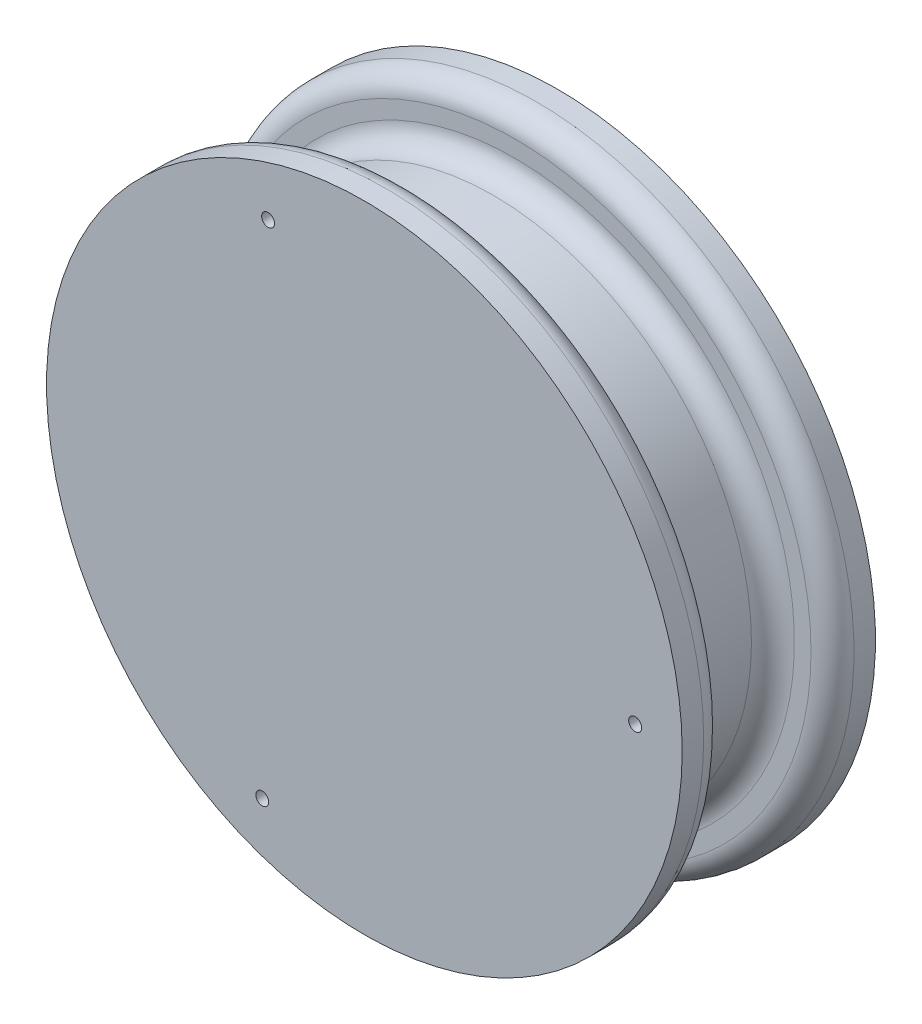
ISO-10303-21;
HEADER;
FILE_DESCRIPTION(('STEP AP214'),'2;1');
FILE_NAME('part.step','',(''),(''),'','','');
FILE_SCHEMA(('AUTOMOTIVE_DESIGN { 1 0 10303 214 1 1 1 1 }'));
ENDSEC;
DATA;
#1=APPLICATION_CONTEXT('core data for automotive mechanical design processes');
#2=APPLICATION_PROTOCOL_DEFINITION('international standard','automotive_design',2000,#1);
#3=PRODUCT_CONTEXT('',#1,'mechanical');
#4=PRODUCT('Part','Part','',(#3));
#5=PRODUCT_RELATED_PRODUCT_CATEGORY('part','',(#4));
#6=PRODUCT_DEFINITION_FORMATION('','',#4);
#7=PRODUCT_DEFINITION_CONTEXT('part definition',#1,'design');
#8=PRODUCT_DEFINITION('design','',#6,#7);
#9=PRODUCT_DEFINITION_SHAPE('','',#8);
#10=(LENGTH_UNIT() NAMED_UNIT(*) SI_UNIT(.MILLI.,.METRE.));
#11=(NAMED_UNIT(*) PLANE_ANGLE_UNIT() SI_UNIT($,.RADIAN.));
#12=(NAMED_UNIT(*) SI_UNIT($,.STERADIAN.) SOLID_ANGLE_UNIT());
#13=UNCERTAINTY_MEASURE_WITH_UNIT(LENGTH_MEASURE(1.E-05),#10,'distance_accuracy_value','');
#14=(GEOMETRIC_REPRESENTATION_CONTEXT(3) GLOBAL_UNCERTAINTY_ASSIGNED_CONTEXT((#13)) GLOBAL_UNIT_ASSIGNED_CONTEXT((#10,
#11,#12)) REPRESENTATION_CONTEXT('',''));
#15=CARTESIAN_POINT('',(0.,0.,0.));
#16=DIRECTION('',(0.,0.,1.));
#17=DIRECTION('',(1.,0.,0.));
#18=AXIS2_PLACEMENT_3D('',#15,#16,#17);
#19=CARTESIAN_POINT('',(0.,0.,-10.8));
#20=DIRECTION('',(0.,0.,-1.));
#21=DIRECTION('',(-1.,0.,0.));
#22=AXIS2_PLACEMENT_3D('',#19,#20,#21);
#23=PLANE('',#22);
#24=CARTESIAN_POINT('',(0.,0.,-10.8));
#25=DIRECTION('',(0.,0.,-1.));
#26=DIRECTION('',(-1.,0.,0.));
#27=AXIS2_PLACEMENT_3D('',#24,#25,#26);
#28=CIRCLE('',#27,6.08553702502468);
#29=CARTESIAN_POINT('',(6.08553702502468,0.,-10.8));
#30=VERTEX_POINT('',#29);
#31=EDGE_CURVE('E229',#30,#30,#28,.T.);
#32=ORIENTED_EDGE('',*,*,#31,.T.);
#33=EDGE_LOOP('',(#32));
#34=FACE_BOUND('',#33,.T.);
#35=CARTESIAN_POINT('',(0.,0.,-10.8));
#36=DIRECTION('',(0.,0.,-1.));
#37=DIRECTION('',(-1.,0.,0.));
#38=AXIS2_PLACEMENT_3D('',#35,#36,#37);
#39=CIRCLE('',#38,3.4);
#40=CARTESIAN_POINT('',(-2.50399680510978,-2.3,-10.8));
#41=VERTEX_POINT('',#40);
#42=CARTESIAN_POINT('',(-2.50399680510978,2.3,-10.8));
#43=VERTEX_POINT('',#42);
#44=EDGE_CURVE('E252',#41,#43,#39,.T.);
#45=ORIENTED_EDGE('',*,*,#44,.F.);
#46=DIRECTION('',(1.,0.,0.));
#47=VECTOR('',#46,1.);
#48=CARTESIAN_POINT('',(0.,-2.3,-10.8));
#49=LINE('',#48,#47);
#50=CARTESIAN_POINT('',(2.50399680510978,-2.3,-10.8));
#51=VERTEX_POINT('',#50);
#52=EDGE_CURVE('E242',#41,#51,#49,.T.);
#53=ORIENTED_EDGE('',*,*,#52,.T.);
#54=CARTESIAN_POINT('',(0.,0.,-10.8));
#55=DIRECTION('',(0.,0.,1.));
#56=DIRECTION('',(1.,0.,0.));
#57=AXIS2_PLACEMENT_3D('',#54,#55,#56);
#58=CIRCLE('',#57,3.4);
#59=CARTESIAN_POINT('',(2.50399680510978,2.3,-10.8));
#60=VERTEX_POINT('',#59);
#61=EDGE_CURVE('E246',#51,#60,#58,.T.);
#62=ORIENTED_EDGE('',*,*,#61,.T.);
#63=DIRECTION('',(1.,0.,0.));
#64=VECTOR('',#63,1.);
#65=CARTESIAN_POINT('',(0.,2.3,-10.8));
#66=LINE('',#65,#64);
#67=EDGE_CURVE('E249',#43,#60,#66,.T.);
#68=ORIENTED_EDGE('',*,*,#67,.F.);
#69=EDGE_LOOP('',(#45,#53,#62,#68));
#70=FACE_BOUND('',#69,.T.);
#71=ADVANCED_FACE('F37',(#34,#70),#23,.T.);
#72=CARTESIAN_POINT('',(0.,0.,2.));
#73=DIRECTION('',(0.,0.,-1.));
#74=DIRECTION('',(-1.,0.,0.));
#75=AXIS2_PLACEMENT_3D('',#72,#73,#74);
#76=CYLINDRICAL_SURFACE('',#75,14.7992420917299);
#77=CARTESIAN_POINT('',(0.,0.,1.));
#78=DIRECTION('',(0.,0.,1.));
#79=DIRECTION('',(1.,0.,0.));
#80=AXIS2_PLACEMENT_3D('',#77,#78,#79);
#81=CIRCLE('',#80,14.7992420917299);
#82=CARTESIAN_POINT('',(14.7992420917299,0.,1.));
#83=VERTEX_POINT('',#82);
#84=EDGE_CURVE('E217',#83,#83,#81,.T.);
#85=ORIENTED_EDGE('',*,*,#84,.T.);
#86=EDGE_LOOP('',(#85));
#87=FACE_BOUND('',#86,.T.);
#88=CARTESIAN_POINT('',(0.,0.,2.));
#89=DIRECTION('',(0.,0.,1.));
#90=DIRECTION('',(1.,0.,0.));
#91=AXIS2_PLACEMENT_3D('',#88,#89,#90);
#92=CIRCLE('',#91,14.7992420917299);
#93=CARTESIAN_POINT('',(14.7992420917299,0.,2.));
#94=VERTEX_POINT('',#93);
#95=EDGE_CURVE('E222',#94,#94,#92,.T.);
#96=ORIENTED_EDGE('',*,*,#95,.F.);
#97=EDGE_LOOP('',(#96));
#98=FACE_BOUND('',#97,.T.);
#99=ADVANCED_FACE('F176',(#87,#98),#76,.T.);
#100=CARTESIAN_POINT('',(0.,0.,2.));
#101=DIRECTION('',(0.,0.,1.));
#102=DIRECTION('',(1.,0.,0.));
#103=AXIS2_PLACEMENT_3D('',#100,#101,#102);
#104=PLANE('',#103);
#105=CARTESIAN_POINT('',(12.6107717154399,0.,2.));
#106=DIRECTION('',(0.,0.,1.));
#107=DIRECTION('',(1.,0.,0.));
#108=AXIS2_PLACEMENT_3D('',#105,#106,#107);
#109=CIRCLE('',#108,0.302475122375686);
#110=CARTESIAN_POINT('',(12.9132468378156,0.,2.));
#111=VERTEX_POINT('',#110);
#112=EDGE_CURVE('E110',#111,#111,#109,.T.);
#113=ORIENTED_EDGE('',*,*,#112,.F.);
#114=EDGE_LOOP('',(#113));
#115=FACE_BOUND('',#114,.T.);
#116=CARTESIAN_POINT('',(-4.48430239626418,11.7865429739936,2.));
#117=DIRECTION('',(0.,0.,1.));
#118=DIRECTION('',(1.,0.,0.));
#119=AXIS2_PLACEMENT_3D('',#116,#117,#118);
#120=CIRCLE('',#119,0.3);
#121=CARTESIAN_POINT('',(-4.18430239626418,11.7865429739936,2.));
#122=VERTEX_POINT('',#121);
#123=EDGE_CURVE('E269',#122,#122,#120,.T.);
#124=ORIENTED_EDGE('',*,*,#123,.F.);
#125=EDGE_LOOP('',(#124));
#126=FACE_BOUND('',#125,.T.);
#127=CARTESIAN_POINT('',(-4.75570442853812,-11.679676307472,2.));
#128=DIRECTION('',(0.,0.,1.));
#129=DIRECTION('',(1.,0.,0.));
#130=AXIS2_PLACEMENT_3D('',#127,#128,#129);
#131=CIRCLE('',#130,0.3);
#132=CARTESIAN_POINT('',(-4.45570442853812,-11.679676307472,2.));
#133=VERTEX_POINT('',#132);
#134=EDGE_CURVE('E266',#133,#133,#131,.T.);
#135=ORIENTED_EDGE('',*,*,#134,.F.);
#136=EDGE_LOOP('',(#135));
#137=FACE_BOUND('',#136,.T.);
#138=ORIENTED_EDGE('',*,*,#95,.T.);
#139=EDGE_LOOP('',(#138));
#140=FACE_BOUND('',#139,.T.);
#141=ADVANCED_FACE('F199',(#115,#126,#137,#140),#104,.T.);
#142=CARTESIAN_POINT('',(0.,0.,0.));
#143=DIRECTION('',(0.,0.,1.));
#144=DIRECTION('',(1.,0.,0.));
#145=AXIS2_PLACEMENT_3D('',#142,#143,#144);
#146=PLANE('',#145);
#147=CARTESIAN_POINT('',(0.,0.,0.));
#148=DIRECTION('',(0.,0.,1.));
#149=DIRECTION('',(1.,0.,0.));
#150=AXIS2_PLACEMENT_3D('',#147,#148,#149);
#151=CIRCLE('',#150,12.5233787791366);
#152=CARTESIAN_POINT('',(-4.4566563623957,-11.7035563019642,4.64690504625795E-13));
#153=VERTEX_POINT('',#152);
#154=CARTESIAN_POINT('',(12.5200540946433,-0.288550711198555,0.));
#155=VERTEX_POINT('',#154);
#156=EDGE_CURVE('E106',#153,#155,#151,.T.);
#157=ORIENTED_EDGE('',*,*,#156,.T.);
#158=CARTESIAN_POINT('',(12.6107717154399,0.,0.));
#159=DIRECTION('',(0.,0.,1.));
#160=DIRECTION('',(1.,0.,0.));
#161=AXIS2_PLACEMENT_3D('',#158,#159,#160);
#162=CIRCLE('',#161,0.302475122375686);
#163=CARTESIAN_POINT('',(12.5200540946433,0.288550711198555,0.));
#164=VERTEX_POINT('',#163);
#165=EDGE_CURVE('E51',#155,#164,#162,.T.);
#166=ORIENTED_EDGE('',*,*,#165,.T.);
#167=CARTESIAN_POINT('',(-4.18478202193797,11.8035001365948,0.));
#168=VERTEX_POINT('',#167);
#169=EDGE_CURVE('E100',#164,#168,#151,.T.);
#170=ORIENTED_EDGE('',*,*,#169,.T.);
#171=CARTESIAN_POINT('',(-4.48430239626418,11.7865429739936,0.));
#172=DIRECTION('',(0.,0.,1.));
#173=DIRECTION('',(1.,0.,0.));
#174=AXIS2_PLACEMENT_3D('',#171,#172,#173);
#175=CIRCLE('',#174,0.3);
#176=CARTESIAN_POINT('',(-4.71934771332979,11.6001195341434,0.));
#177=VERTEX_POINT('',#176);
#178=EDGE_CURVE('E109',#168,#177,#175,.T.);
#179=ORIENTED_EDGE('',*,*,#178,.T.);
#180=CARTESIAN_POINT('',(-4.98637523368144,-11.487866558881,0.));
#181=VERTEX_POINT('',#180);
#182=EDGE_CURVE('E108',#177,#181,#151,.T.);
#183=ORIENTED_EDGE('',*,*,#182,.T.);
#184=CARTESIAN_POINT('',(-4.75570442853812,-11.679676307472,0.));
#185=DIRECTION('',(0.,0.,1.));
#186=DIRECTION('',(1.,0.,0.));
#187=AXIS2_PLACEMENT_3D('',#184,#185,#186);
#188=CIRCLE('',#187,0.3);
#189=EDGE_CURVE('E58',#181,#153,#188,.T.);
#190=ORIENTED_EDGE('',*,*,#189,.T.);
#191=EDGE_LOOP('',(#157,#166,#170,#179,#183,#190));
#192=FACE_BOUND('',#191,.T.);
#193=CARTESIAN_POINT('',(0.,0.,0.));
#194=DIRECTION('',(0.,0.,1.));
#195=DIRECTION('',(1.,0.,0.));
#196=AXIS2_PLACEMENT_3D('',#193,#194,#195);
#197=CIRCLE('',#196,13.7992420917299);
#198=CARTESIAN_POINT('',(13.7992420917299,0.,0.));
#199=VERTEX_POINT('',#198);
#200=EDGE_CURVE('E119',#199,#199,#197,.F.);
#201=ORIENTED_EDGE('',*,*,#200,.T.);
#202=EDGE_LOOP('',(#201));
#203=FACE_BOUND('',#202,.T.);
#204=ADVANCED_FACE('F104',(#192,#203),#146,.F.);
#205=CARTESIAN_POINT('',(0.,0.,-5.));
#206=DIRECTION('',(0.,0.,1.));
#207=DIRECTION('',(1.,0.,0.));
#208=AXIS2_PLACEMENT_3D('',#205,#206,#207);
#209=CYLINDRICAL_SURFACE('',#208,12.0233787791366);
#210=CARTESIAN_POINT('',(0.,0.,-4.));
#211=DIRECTION('',(0.,0.,-1.));
#212=DIRECTION('',(-1.,0.,0.));
#213=AXIS2_PLACEMENT_3D('',#210,#211,#212);
#214=CIRCLE('',#213,12.0233787791366);
#215=CARTESIAN_POINT('',(-12.0233787791366,0.,-4.));
#216=VERTEX_POINT('',#215);
#217=EDGE_CURVE('E295',#216,#216,#214,.F.);
#218=ORIENTED_EDGE('',*,*,#217,.T.);
#219=EDGE_LOOP('',(#218));
#220=FACE_BOUND('',#219,.T.);
#221=CARTESIAN_POINT('',(0.,0.,-0.5));
#222=DIRECTION('',(0.,0.,1.));
#223=DIRECTION('',(1.,0.,0.));
#224=AXIS2_PLACEMENT_3D('',#221,#222,#223);
#225=CIRCLE('',#224,12.0233787791366);
#226=CARTESIAN_POINT('',(12.0233787791366,0.,-0.5));
#227=VERTEX_POINT('',#226);
#228=EDGE_CURVE('E116',#227,#227,#225,.F.);
#229=ORIENTED_EDGE('',*,*,#228,.T.);
#230=EDGE_LOOP('',(#229));
#231=FACE_BOUND('',#230,.T.);
#232=ADVANCED_FACE('F194',(#220,#231),#209,.T.);
#233=CARTESIAN_POINT('',(0.,0.,-7.));
#234=DIRECTION('',(0.,0.,1.));
#235=DIRECTION('',(1.,0.,0.));
#236=AXIS2_PLACEMENT_3D('',#233,#234,#235);
#237=CYLINDRICAL_SURFACE('',#236,14.7986145790035);
#238=CARTESIAN_POINT('',(0.,0.,-6.));
#239=DIRECTION('',(0.,0.,-1.));
#240=DIRECTION('',(-1.,0.,0.));
#241=AXIS2_PLACEMENT_3D('',#238,#239,#240);
#242=CIRCLE('',#241,14.7986145790035);
#243=CARTESIAN_POINT('',(-14.7986145790035,0.,-6.));
#244=VERTEX_POINT('',#243);
#245=EDGE_CURVE('E45',#244,#244,#242,.T.);
#246=ORIENTED_EDGE('',*,*,#245,.T.);
#247=EDGE_LOOP('',(#246));
#248=FACE_BOUND('',#247,.T.);
#249=CARTESIAN_POINT('',(0.,0.,-7.));
#250=DIRECTION('',(0.,0.,-1.));
#251=DIRECTION('',(-1.,0.,0.));
#252=AXIS2_PLACEMENT_3D('',#249,#250,#251);
#253=CIRCLE('',#252,14.7986145790035);
#254=CARTESIAN_POINT('',(-14.7986145790035,0.,-7.));
#255=VERTEX_POINT('',#254);
#256=EDGE_CURVE('E227',#255,#255,#253,.T.);
#257=ORIENTED_EDGE('',*,*,#256,.F.);
#258=EDGE_LOOP('',(#257));
#259=FACE_BOUND('',#258,.T.);
#260=ADVANCED_FACE('F187',(#248,#259),#237,.T.);
#261=CARTESIAN_POINT('',(0.,0.,-7.));
#262=DIRECTION('',(0.,0.,-1.));
#263=DIRECTION('',(-1.,0.,0.));
#264=AXIS2_PLACEMENT_3D('',#261,#262,#263);
#265=PLANE('',#264);
#266=CARTESIAN_POINT('',(0.,0.,-7.));
#267=DIRECTION('',(0.,0.,-1.));
#268=DIRECTION('',(-1.,0.,0.));
#269=AXIS2_PLACEMENT_3D('',#266,#267,#268);
#270=CIRCLE('',#269,6.08553702502468);
#271=CARTESIAN_POINT('',(6.08553702502468,0.,-7.));
#272=VERTEX_POINT('',#271);
#273=EDGE_CURVE('E218',#272,#272,#270,.T.);
#274=ORIENTED_EDGE('',*,*,#273,.F.);
#275=EDGE_LOOP('',(#274));
#276=FACE_BOUND('',#275,.T.);
#277=ORIENTED_EDGE('',*,*,#256,.T.);
#278=EDGE_LOOP('',(#277));
#279=FACE_BOUND('',#278,.T.);
#280=ADVANCED_FACE('F184',(#276,#279),#265,.T.);
#281=CARTESIAN_POINT('',(0.,0.,-5.));
#282=DIRECTION('',(0.,0.,-1.));
#283=DIRECTION('',(-1.,0.,0.));
#284=AXIS2_PLACEMENT_3D('',#281,#282,#283);
#285=PLANE('',#284);
#286=CARTESIAN_POINT('',(0.,0.,-5.));
#287=DIRECTION('',(0.,0.,-1.));
#288=DIRECTION('',(-1.,0.,0.));
#289=AXIS2_PLACEMENT_3D('',#286,#287,#288);
#290=CIRCLE('',#289,13.7986145790035);
#291=CARTESIAN_POINT('',(-13.7986145790035,0.,-5.));
#292=VERTEX_POINT('',#291);
#293=EDGE_CURVE('E11',#292,#292,#290,.F.);
#294=ORIENTED_EDGE('',*,*,#293,.T.);
#295=EDGE_LOOP('',(#294));
#296=FACE_BOUND('',#295,.T.);
#297=CARTESIAN_POINT('',(0.,0.,-5.));
#298=DIRECTION('',(0.,0.,-1.));
#299=DIRECTION('',(-1.,0.,0.));
#300=AXIS2_PLACEMENT_3D('',#297,#298,#299);
#301=CIRCLE('',#300,13.0233787791366);
#302=CARTESIAN_POINT('',(-13.0233787791366,0.,-5.));
#303=VERTEX_POINT('',#302);
#304=EDGE_CURVE('E125',#303,#303,#301,.T.);
#305=ORIENTED_EDGE('',*,*,#304,.T.);
#306=EDGE_LOOP('',(#305));
#307=FACE_BOUND('',#306,.T.);
#308=ADVANCED_FACE('F182',(#296,#307),#285,.F.);
#309=CARTESIAN_POINT('',(0.,0.,-10.8));
#310=DIRECTION('',(0.,0.,1.));
#311=DIRECTION('',(1.,0.,0.));
#312=AXIS2_PLACEMENT_3D('',#309,#310,#311);
#313=CYLINDRICAL_SURFACE('',#312,6.08553702502468);
#314=CARTESIAN_POINT('',(6.08553702502468,0.,-10.8));
#315=CARTESIAN_POINT('',(6.08553702502468,0.,-10.7604166666667));
#316=CARTESIAN_POINT('',(6.08553702502468,0.,-10.7208333333333));
#317=CARTESIAN_POINT('',(6.08553702502468,0.,-10.6416666666667));
#318=CARTESIAN_POINT('',(6.08553702502468,0.,-10.6020833333333));
#319=CARTESIAN_POINT('',(6.08553702502468,0.,-10.5229166666667));
#320=CARTESIAN_POINT('',(6.08553702502468,0.,-10.4833333333333));
#321=CARTESIAN_POINT('',(6.08553702502468,0.,-10.4041666666667));
#322=CARTESIAN_POINT('',(6.08553702502468,0.,-10.3645833333333));
#323=CARTESIAN_POINT('',(6.08553702502468,0.,-10.2854166666667));
#324=CARTESIAN_POINT('',(6.08553702502468,0.,-10.2458333333333));
#325=CARTESIAN_POINT('',(6.08553702502468,0.,-10.1666666666667));
#326=CARTESIAN_POINT('',(6.08553702502468,0.,-10.1270833333333));
#327=CARTESIAN_POINT('',(6.08553702502468,0.,-10.0479166666667));
#328=CARTESIAN_POINT('',(6.08553702502468,0.,-10.0083333333333));
#329=CARTESIAN_POINT('',(6.08553702502468,0.,-9.92916666666667));
#330=CARTESIAN_POINT('',(6.08553702502468,0.,-9.88958333333333));
#331=CARTESIAN_POINT('',(6.08553702502468,0.,-9.81041666666667));
#332=CARTESIAN_POINT('',(6.08553702502468,0.,-9.77083333333333));
#333=CARTESIAN_POINT('',(6.08553702502468,0.,-9.69166666666667));
#334=CARTESIAN_POINT('',(6.08553702502468,0.,-9.65208333333333));
#335=CARTESIAN_POINT('',(6.08553702502468,0.,-9.57291666666667));
#336=CARTESIAN_POINT('',(6.08553702502468,0.,-9.53333333333333));
#337=CARTESIAN_POINT('',(6.08553702502468,0.,-9.45416666666667));
#338=CARTESIAN_POINT('',(6.08553702502468,0.,-9.41458333333333));
#339=CARTESIAN_POINT('',(6.08553702502468,0.,-9.33541666666667));
#340=CARTESIAN_POINT('',(6.08553702502468,0.,-9.29583333333333));
#341=CARTESIAN_POINT('',(6.08553702502468,0.,-9.21666666666667));
#342=CARTESIAN_POINT('',(6.08553702502468,0.,-9.17708333333333));
#343=CARTESIAN_POINT('',(6.08553702502468,0.,-9.09791666666667));
#344=CARTESIAN_POINT('',(6.08553702502468,0.,-9.05833333333333));
#345=CARTESIAN_POINT('',(6.08553702502468,0.,-8.97916666666667));
#346=CARTESIAN_POINT('',(6.08553702502468,0.,-8.93958333333333));
#347=CARTESIAN_POINT('',(6.08553702502468,0.,-8.86041666666667));
#348=CARTESIAN_POINT('',(6.08553702502468,0.,-8.82083333333333));
#349=CARTESIAN_POINT('',(6.08553702502468,0.,-8.74166666666667));
#350=CARTESIAN_POINT('',(6.08553702502468,0.,-8.70208333333333));
#351=CARTESIAN_POINT('',(6.08553702502468,0.,-8.62291666666667));
#352=CARTESIAN_POINT('',(6.08553702502468,0.,-8.58333333333333));
#353=CARTESIAN_POINT('',(6.08553702502468,0.,-8.50416666666667));
#354=CARTESIAN_POINT('',(6.08553702502468,0.,-8.46458333333333));
#355=CARTESIAN_POINT('',(6.08553702502468,0.,-8.38541666666667));
#356=CARTESIAN_POINT('',(6.08553702502468,0.,-8.34583333333333));
#357=CARTESIAN_POINT('',(6.08553702502468,0.,-8.26666666666667));
#358=CARTESIAN_POINT('',(6.08553702502468,0.,-8.22708333333333));
#359=CARTESIAN_POINT('',(6.08553702502468,0.,-8.14791666666667));
#360=CARTESIAN_POINT('',(6.08553702502468,0.,-8.10833333333333));
#361=CARTESIAN_POINT('',(6.08553702502468,0.,-8.02916666666667));
#362=CARTESIAN_POINT('',(6.08553702502468,0.,-7.98958333333333));
#363=CARTESIAN_POINT('',(6.08553702502468,0.,-7.91041666666667));
#364=CARTESIAN_POINT('',(6.08553702502468,0.,-7.87083333333333));
#365=CARTESIAN_POINT('',(6.08553702502468,0.,-7.79166666666667));
#366=CARTESIAN_POINT('',(6.08553702502468,0.,-7.75208333333333));
#367=CARTESIAN_POINT('',(6.08553702502468,0.,-7.67291666666667));
#368=CARTESIAN_POINT('',(6.08553702502468,0.,-7.63333333333333));
#369=CARTESIAN_POINT('',(6.08553702502468,0.,-7.55416666666667));
#370=CARTESIAN_POINT('',(6.08553702502468,0.,-7.51458333333333));
#371=CARTESIAN_POINT('',(6.08553702502468,0.,-7.43541666666667));
#372=CARTESIAN_POINT('',(6.08553702502468,0.,-7.39583333333333));
#373=CARTESIAN_POINT('',(6.08553702502468,0.,-7.31666666666667));
#374=CARTESIAN_POINT('',(6.08553702502468,0.,-7.27708333333333));
#375=CARTESIAN_POINT('',(6.08553702502468,0.,-7.19791666666667));
#376=CARTESIAN_POINT('',(6.08553702502468,0.,-7.15833333333333));
#377=CARTESIAN_POINT('',(6.08553702502468,0.,-7.07916666666667));
#378=CARTESIAN_POINT('',(6.08553702502468,0.,-7.03958333333333));
#379=CARTESIAN_POINT('',(6.08553702502468,0.,-7.));
#380=B_SPLINE_CURVE_WITH_KNOTS('',3,(#314,#315,#316,#317,#318,#319,#320,#321,#322,#323,#324,
#325,#326,#327,#328,#329,#330,#331,#332,#333,#334,#335,#336,#337,#338,#339,#340,#341,#342,#343,
#344,#345,#346,#347,#348,#349,#350,#351,#352,#353,#354,#355,#356,#357,#358,#359,#360,#361,#362,
#363,#364,#365,#366,#367,#368,#369,#370,#371,#372,#373,#374,#375,#376,#377,#378,#379),
.UNSPECIFIED.,.F.,.F.,(4,2,2,2,2,2,2,2,2,2,2,2,2,2,2,2,2,2,2,2,2,2,2,2,2,2,2,2,2,2,2,2,4),(0.,
0.118750000000001,0.237500000000002,0.356250000000001,0.475000000000001,0.593750000000001,
0.712500000000001,0.83125,0.950000000000001,1.06875,1.1875,1.30625,1.425,1.54375,1.6625,1.78125,
1.9,2.01875,2.1375,2.25625,2.375,2.49375,2.6125,2.73125,2.85,2.96875,3.0875,3.20625,3.325,
3.44375,3.5625,3.68125,3.8),.UNSPECIFIED.);
#381=EDGE_CURVE('BSEAM178',#30,#272,#380,.T.);
#382=ORIENTED_EDGE('',*,*,#31,.F.);
#383=ORIENTED_EDGE('',*,*,#273,.T.);
#384=ORIENTED_EDGE('',*,*,#381,.T.);
#385=ORIENTED_EDGE('',*,*,#381,.F.);
#386=EDGE_LOOP('',(#382,#384,#383,#385));
#387=FACE_BOUND('',#386,.T.);
#388=ADVANCED_FACE('F178',(#387),#313,.T.);
#389=CARTESIAN_POINT('',(0.,0.,1.));
#390=DIRECTION('',(0.,0.,1.));
#391=DIRECTION('',(1.,0.,0.));
#392=AXIS2_PLACEMENT_3D('',#389,#390,#391);
#393=TOROIDAL_SURFACE('',#392,13.7992420917299,1.);
#394=ORIENTED_EDGE('',*,*,#200,.F.);
#395=EDGE_LOOP('',(#394));
#396=FACE_BOUND('',#395,.T.);
#397=ORIENTED_EDGE('',*,*,#84,.F.);
#398=EDGE_LOOP('',(#397));
#399=FACE_BOUND('',#398,.T.);
#400=ADVANCED_FACE('F181',(#396,#399),#393,.T.);
#401=CARTESIAN_POINT('',(0.,0.,-0.5));
#402=DIRECTION('',(0.,0.,1.));
#403=DIRECTION('',(1.,0.,0.));
#404=AXIS2_PLACEMENT_3D('',#401,#402,#403);
#405=TOROIDAL_SURFACE('',#404,12.5233787791366,0.5);
#406=ORIENTED_EDGE('',*,*,#169,.F.);
#407=CARTESIAN_POINT('',(12.5235787791366,0.289635273257571,-1.25939858864616E-05));
#408=CARTESIAN_POINT('',(12.5080786510195,0.284986360388358,0.000115837755022511));
#409=CARTESIAN_POINT('',(12.4929926259065,0.279072847435222,-0.000523431199044845));
#410=CARTESIAN_POINT('',(12.4640956284769,0.265011975531821,-0.00298884062684197));
#411=CARTESIAN_POINT('',(12.4502784816845,0.256876294277177,-0.00480884315129415));
#412=CARTESIAN_POINT('',(12.4242273975954,0.238633274455882,-0.0092879761417755));
#413=CARTESIAN_POINT('',(12.4119900310201,0.228530330178104,-0.0119452444314353));
#414=CARTESIAN_POINT('',(12.3892742039025,0.206590568391903,-0.0176979206911068));
#415=CARTESIAN_POINT('',(12.378798468827,0.194751116309462,-0.0207939941574501));
#416=CARTESIAN_POINT('',(12.3591245606189,0.168673455775074,-0.0272272899409577));
#417=CARTESIAN_POINT('',(12.3500744295105,0.154323482088746,-0.0305656953477765));
#418=CARTESIAN_POINT('',(12.3344637622153,0.124226642410322,-0.0367322201147774));
#419=CARTESIAN_POINT('',(12.327902501,0.108480184877231,-0.0395604879561471));
#420=CARTESIAN_POINT('',(12.3174702388802,0.0758893803269397,-0.0442280958097118));
#421=CARTESIAN_POINT('',(12.3136115330771,0.0590403921818752,-0.0460629076885877));
#422=CARTESIAN_POINT('',(12.3088258810117,0.0248451265690858,-0.0483579081229162));
#423=CARTESIAN_POINT('',(12.3078963326173,0.0074993042999045,-0.0488193167279898));
#424=CARTESIAN_POINT('',(12.3089599842928,-0.0254139945409841,-0.0483016294469977));
#425=CARTESIAN_POINT('',(12.3106827587041,-0.0409932272686581,-0.0474557856393504));
#426=CARTESIAN_POINT('',(12.3164827246131,-0.071610743124193,-0.0447124799419759));
#427=CARTESIAN_POINT('',(12.3205605992948,-0.0866488679384352,-0.0428147129094687));
#428=CARTESIAN_POINT('',(12.3309497718497,-0.115902656523082,-0.0382528856420147));
#429=CARTESIAN_POINT('',(12.3372739888099,-0.130112997398346,-0.0355844098815888));
#430=CARTESIAN_POINT('',(12.3519808754893,-0.157347749186162,-0.0298646141610659));
#431=CARTESIAN_POINT('',(12.3603649719049,-0.170371329527159,-0.0268130295747349));
#432=CARTESIAN_POINT('',(12.3799495377256,-0.196215425499588,-0.0204274716163641));
#433=CARTESIAN_POINT('',(12.391346735405,-0.208888001296537,-0.0170954725920676));
#434=CARTESIAN_POINT('',(12.4161746851245,-0.232190874168906,-0.0109854275775548));
#435=CARTESIAN_POINT('',(12.4296027283044,-0.242823849556253,-0.00820665493080411));
#436=CARTESIAN_POINT('',(12.4560859140286,-0.260339089982103,-0.00403102309566175));
#437=CARTESIAN_POINT('',(12.4689053122235,-0.267543010186496,-0.00249100689713253));
#438=CARTESIAN_POINT('',(12.4955595457837,-0.280065811655138,-0.000423107807770075));
#439=CARTESIAN_POINT('',(12.5093976817588,-0.285378208185457,0.000101320085793359));
#440=CARTESIAN_POINT('',(12.5235787791366,-0.28963527325757,-1.25939858865068E-05));
#441=B_SPLINE_CURVE_WITH_KNOTS('',3,(#407,#408,#409,#410,#411,#412,#413,#414,#415,#416,#417,
#418,#419,#420,#421,#422,#423,#424,#425,#426,#427,#428,#429,#430,#431,#432,#433,#434,#435,#436,
#437,#438,#439,#440),.UNSPECIFIED.,.F.,.F.,(4,2,2,2,2,2,2,2,2,2,2,2,2,2,2,2,4),(0.,
0.0484219511689799,0.0965941801229651,0.144660015858997,0.192799544683455,0.244435309449096,
0.296056020715627,0.347910077791964,0.399718057046086,0.446582509177065,0.49346056290784,
0.540612705617158,0.587797598974847,0.639657057883951,0.691447943947402,0.735619861884081,
0.779941789029147),.UNSPECIFIED.);
#442=EDGE_CURVE('E115',#164,#155,#441,.T.);
#443=ORIENTED_EDGE('',*,*,#442,.T.);
#444=ORIENTED_EDGE('',*,*,#156,.F.);
#445=CARTESIAN_POINT('',(-4.94573888093186,-11.9118118431045,-0.168553691276536));
#446=CARTESIAN_POINT('',(-4.9370897087393,-11.9188920225513,-0.172193522250036));
#447=CARTESIAN_POINT('',(-4.92790908088392,-11.925599233733,-0.175335612764853));
#448=CARTESIAN_POINT('',(-4.90857467797946,-11.9380611327525,-0.180263158366366));
#449=CARTESIAN_POINT('',(-4.89842096369037,-11.9438158800014,-0.182048698094685));
#450=CARTESIAN_POINT('',(-4.87731579202005,-11.9541746122724,-0.183996178775398));
#451=CARTESIAN_POINT('',(-4.86636025697658,-11.9587720989312,-0.184149142568002));
#452=CARTESIAN_POINT('',(-4.8440784601991,-11.9666080020471,-0.182781552845058));
#453=CARTESIAN_POINT('',(-4.83275209385179,-11.9698460313708,-0.181260523071514));
#454=CARTESIAN_POINT('',(-4.80830309794694,-11.9753352261513,-0.176434548373701));
#455=CARTESIAN_POINT('',(-4.79517742488107,-11.9773518832883,-0.172887179439453));
#456=CARTESIAN_POINT('',(-4.7692120339799,-11.9796570375125,-0.164427021578815));
#457=CARTESIAN_POINT('',(-4.75637313184062,-11.9799411089622,-0.159510769468144));
#458=CARTESIAN_POINT('',(-4.72578024320764,-11.9787218733399,-0.146567740734292));
#459=CARTESIAN_POINT('',(-4.70824525520131,-11.9764113945338,-0.138105018244038));
#460=CARTESIAN_POINT('',(-4.67415556418273,-11.9689078807619,-0.120520449348122));
#461=CARTESIAN_POINT('',(-4.6576021746908,-11.9637110757002,-0.111397754475307));
#462=CARTESIAN_POINT('',(-4.6251634553812,-11.9503689256281,-0.0929740503132344));
#463=CARTESIAN_POINT('',(-4.60930785565763,-11.94214840087,-0.0836748018656168));
#464=CARTESIAN_POINT('',(-4.57904208393821,-11.9228057747534,-0.0657908535970093));
#465=CARTESIAN_POINT('',(-4.56462980128795,-11.9116879986053,-0.057205113591185));
#466=CARTESIAN_POINT('',(-4.5400733931547,-11.8888007400983,-0.0427279547774613));
#467=CARTESIAN_POINT('',(-4.52962463812742,-11.8774910847498,-0.0366283408503877));
#468=CARTESIAN_POINT('',(-4.51036885929012,-11.8530320559449,-0.0256252505309846));
#469=CARTESIAN_POINT('',(-4.50156089466443,-11.8398837443781,-0.0207210881757195));
#470=CARTESIAN_POINT('',(-4.48593843278588,-11.8119048665611,-0.0123551238418772));
#471=CARTESIAN_POINT('',(-4.47913686826636,-11.7970642064531,-0.00890262074866041));
#472=CARTESIAN_POINT('',(-4.46798945980219,-11.7662129731598,-0.00365603684529145));
#473=CARTESIAN_POINT('',(-4.46364235447606,-11.7502030056848,-0.00186110388427735));
#474=CARTESIAN_POINT('',(-4.45796985449373,-11.7193447309324,-1.8400941359562E-05));
#475=CARTESIAN_POINT('',(-4.45637083329592,-11.7045555037479,0.000195813201004182));
#476=CARTESIAN_POINT('',(-4.45537607428844,-11.6749352921557,-0.000543546668779529));
#477=CARTESIAN_POINT('',(-4.45598045400424,-11.6601043055627,-0.00149718297017713));
#478=CARTESIAN_POINT('',(-4.45935912466712,-11.6306813396848,-0.00434680536059812));
#479=CARTESIAN_POINT('',(-4.46214907516649,-11.6160918642451,-0.00624955594362635));
#480=CARTESIAN_POINT('',(-4.469810401875,-11.5875738335817,-0.0106991205609738));
#481=CARTESIAN_POINT('',(-4.47468264089137,-11.5736455549895,-0.0132462013981915));
#482=CARTESIAN_POINT('',(-4.48698543482581,-11.5453170778019,-0.0189318739148206));
#483=CARTESIAN_POINT('',(-4.49462732444218,-11.5310152949564,-0.0221043482803693));
#484=CARTESIAN_POINT('',(-4.51212342006175,-11.503806597818,-0.0283705482916899));
#485=CARTESIAN_POINT('',(-4.52197890250922,-11.4909004947155,-0.0314642273504148));
#486=CARTESIAN_POINT('',(-4.54437003058548,-11.4660560795546,-0.0372791414060379));
#487=CARTESIAN_POINT('',(-4.55703059753636,-11.4542216122526,-0.039967094904628));
#488=CARTESIAN_POINT('',(-4.58431569940349,-11.4328453869508,-0.0442332351315053));
#489=CARTESIAN_POINT('',(-4.59893827133444,-11.4233013636392,-0.0458125213638647));
#490=CARTESIAN_POINT('',(-4.6285473415501,-11.4074784168075,-0.0474753301650255));
#491=CARTESIAN_POINT('',(-4.64342699974739,-11.4010102589955,-0.0476608093327093));
#492=CARTESIAN_POINT('',(-4.67399916947834,-11.3905653602735,-0.0467705772358704));
#493=CARTESIAN_POINT('',(-4.6896916501255,-11.3865885247705,-0.0456949138600577));
#494=CARTESIAN_POINT('',(-4.7205599585052,-11.3813523136266,-0.0425652856498966));
#495=CARTESIAN_POINT('',(-4.73571952499929,-11.3799609623117,-0.0405657746763268));
#496=CARTESIAN_POINT('',(-4.76597462381827,-11.3794703039726,-0.0359133032967857));
#497=CARTESIAN_POINT('',(-4.78107012930879,-11.3803718775977,-0.0332600921760356));
#498=CARTESIAN_POINT('',(-4.8121028970882,-11.3845767579221,-0.02743225705395));
#499=CARTESIAN_POINT('',(-4.82801014639003,-11.3880674931673,-0.0242328556522442));
#500=CARTESIAN_POINT('',(-4.85908190269277,-11.3975818743086,-0.0179578113090985));
#501=CARTESIAN_POINT('',(-4.87424605194608,-11.4036067270753,-0.0148822281016565));
#502=CARTESIAN_POINT('',(-4.90428735013905,-11.4184887417835,-0.00916627595810021));
#503=CARTESIAN_POINT('',(-4.91910391159943,-11.4274822622626,-0.00655872357336928));
#504=CARTESIAN_POINT('',(-4.94706258542856,-11.447982950565,-0.00250706234804861));
#505=CARTESIAN_POINT('',(-4.96020609119675,-11.459488004692,-0.00106197994012893));
#506=CARTESIAN_POINT('',(-4.98335861375453,-11.4836395567047,0.000200254279105837));
#507=CARTESIAN_POINT('',(-4.9935350353299,-11.496118869951,0.000139435774943468));
#508=CARTESIAN_POINT('',(-5.01171911600974,-11.5224745547763,-0.00150599738861294));
#509=CARTESIAN_POINT('',(-5.01972796391857,-11.5363501548107,-0.00308977460324087));
#510=CARTESIAN_POINT('',(-5.03277792946099,-11.5637424144814,-0.00760165654670473));
#511=CARTESIAN_POINT('',(-5.03801461941732,-11.5771878517029,-0.010402860851945));
#512=CARTESIAN_POINT('',(-5.04645810814747,-11.6044070618464,-0.0172000324969765));
#513=CARTESIAN_POINT('',(-5.04966442500762,-11.6181809119135,-0.0211962831526212));
#514=CARTESIAN_POINT('',(-5.05419357194182,-11.6462803498298,-0.0303971402769153));
#515=CARTESIAN_POINT('',(-5.05543213926789,-11.6606049533744,-0.0356452454829425));
#516=CARTESIAN_POINT('',(-5.05589639339671,-11.6889301817955,-0.0470040282318504));
#517=CARTESIAN_POINT('',(-5.05512192405573,-11.7029307814554,-0.0531147726516616));
#518=CARTESIAN_POINT('',(-5.05144233478526,-11.73254476974,-0.0669397287022379));
#519=CARTESIAN_POINT('',(-5.04822540796312,-11.7480715414514,-0.0747556420419648));
#520=CARTESIAN_POINT('',(-5.03947701596857,-11.7782712732564,-0.0908081789394339));
#521=CARTESIAN_POINT('',(-5.03393966908875,-11.7929419549432,-0.0990458245768444));
#522=CARTESIAN_POINT('',(-5.01946638194057,-11.8237958066525,-0.116947188475625));
#523=CARTESIAN_POINT('',(-5.01010064503881,-11.8397826126398,-0.126603436972844));
#524=CARTESIAN_POINT('',(-4.98827714977315,-11.870085727547,-0.144891273016904));
#525=CARTESIAN_POINT('',(-4.97583572705206,-11.8844102925991,-0.153527928820548));
#526=CARTESIAN_POINT('',(-4.95665541412489,-11.9025406969056,-0.163660677393576));
#527=CARTESIAN_POINT('',(-4.95130728878605,-11.9072535656228,-0.166210338302454));
#528=CARTESIAN_POINT('',(-4.94573888093186,-11.9118118431045,-0.168553691276536));
#529=B_SPLINE_CURVE_WITH_KNOTS('',3,(#445,#446,#447,#448,#449,#450,#451,#452,#453,#454,#455,
#456,#457,#458,#459,#460,#461,#462,#463,#464,#465,#466,#467,#468,#469,#470,#471,#472,#473,#474,
#475,#476,#477,#478,#479,#480,#481,#482,#483,#484,#485,#486,#487,#488,#489,#490,#491,#492,#493,
#494,#495,#496,#497,#498,#499,#500,#501,#502,#503,#504,#505,#506,#507,#508,#509,#510,#511,#512,
#513,#514,#515,#516,#517,#518,#519,#520,#521,#522,#523,#524,#525,#526,#527,#528),.UNSPECIFIED.,
.T.,.F.,(4,2,2,2,2,2,2,2,2,2,2,2,2,2,2,2,2,2,2,2,2,2,2,2,2,2,2,2,2,2,2,2,2,2,2,2,2,2,2,2,2,4),
(0.,0.0352466691908518,0.0704911389946093,0.105929310836029,0.141377567588791,0.182386891885583,
0.223500924800729,0.282011911386342,0.340599504897628,0.400754863756933,0.460820928069826,
0.510305599715963,0.559761809330624,0.609530164126084,0.659272918921987,0.703691450487039,
0.748112351291703,0.792854470432806,0.837615146708266,0.886972301115203,0.936357990194072,
0.988693365318571,1.04097676401738,1.0893945772996,1.13781055209692,1.18367899930677,
1.22956506598352,1.27914356724579,1.3287457069971,1.38104872431845,1.43330789218221,
1.48134724320065,1.52936019343016,1.57325666526641,1.61716355212899,1.66290433451682,
1.70864866495199,1.76148730290317,1.81446069208818,1.87687420206371,1.93896308582735,
1.96165517995925),.UNSPECIFIED.);
#530=EDGE_CURVE('E93',#153,#181,#529,.T.);
#531=ORIENTED_EDGE('',*,*,#530,.T.);
#532=ORIENTED_EDGE('',*,*,#182,.F.);
#533=CARTESIAN_POINT('',(-4.6918395777069,11.5699134193562,-0.00147185603094935));
#534=CARTESIAN_POINT('',(-4.67981040029655,11.558391614709,-0.00264197091266585));
#535=CARTESIAN_POINT('',(-4.66683629773584,11.5478914820793,-0.00446897740956457));
#536=CARTESIAN_POINT('',(-4.63942014598976,11.5292192931477,-0.00904454358169148));
#537=CARTESIAN_POINT('',(-4.62497348395629,11.5210548777433,-0.0117960652415706));
#538=CARTESIAN_POINT('',(-4.595085190661,11.5072641912996,-0.017742154291872));
#539=CARTESIAN_POINT('',(-4.57964836568401,11.5016265842827,-0.0209346571341977));
#540=CARTESIAN_POINT('',(-4.5480653661486,11.4929402668975,-0.0272928814239439));
#541=CARTESIAN_POINT('',(-4.53191946487996,11.4898905681583,-0.0304586126382104));
#542=CARTESIAN_POINT('',(-4.49847769754257,11.4863852930901,-0.0364224373622782));
#543=CARTESIAN_POINT('',(-4.48116348399151,11.4860586470034,-0.0391961964995478));
#544=CARTESIAN_POINT('',(-4.44660402114609,11.4884186500764,-0.0436792015097149));
#545=CARTESIAN_POINT('',(-4.42935872694822,11.4911028289322,-0.045389318285203));
#546=CARTESIAN_POINT('',(-4.39668507144081,11.4991642772965,-0.0473287827676682));
#547=CARTESIAN_POINT('',(-4.38121341204265,11.504343132629,-0.0476520850904651));
#548=CARTESIAN_POINT('',(-4.35133832226025,11.517127955405,-0.0470149872772006));
#549=CARTESIAN_POINT('',(-4.33693476645518,11.5247336373233,-0.046054738113403));
#550=CARTESIAN_POINT('',(-4.31043667717976,11.5415880688189,-0.0431201589345246));
#551=CARTESIAN_POINT('',(-4.2982561671676,11.5507138873076,-0.0412087868797262));
#552=CARTESIAN_POINT('',(-4.27547971867823,11.5706215248049,-0.0366991135069643));
#553=CARTESIAN_POINT('',(-4.26488437732058,11.5814039647641,-0.0341005543464534));
#554=CARTESIAN_POINT('',(-4.24472485856205,11.6052568398472,-0.0283591839269617));
#555=CARTESIAN_POINT('',(-4.23530027821663,11.618438890576,-0.0251900170968968));
#556=CARTESIAN_POINT('',(-4.21867991640915,11.6461644430438,-0.0189266688171216));
#557=CARTESIAN_POINT('',(-4.21148525965257,11.6607086270015,-0.0158325259300241));
#558=CARTESIAN_POINT('',(-4.19914347510545,11.6917789168725,-0.0100055847395223));
#559=CARTESIAN_POINT('',(-4.19414664287033,11.7083717002322,-0.00730599475645578));
#560=CARTESIAN_POINT('',(-4.18707691706374,11.7423080040251,-0.00302317362405686));
#561=CARTESIAN_POINT('',(-4.18500174986517,11.7596509298549,-0.0014390748846742));
#562=CARTESIAN_POINT('',(-4.18394317053665,11.7931922127347,0.000125955260582732));
#563=CARTESIAN_POINT('',(-4.18473799705029,11.8093780392593,0.000218975970866993));
#564=CARTESIAN_POINT('',(-4.18891087091963,11.8413445514392,-0.00112575814840934));
#565=CARTESIAN_POINT('',(-4.19228735451475,11.857125476373,-0.00256258652495581));
#566=CARTESIAN_POINT('',(-4.20102047411847,11.8863581953565,-0.0068077539123862));
#567=CARTESIAN_POINT('',(-4.20617197542318,11.8998918699672,-0.00948128860811494));
#568=CARTESIAN_POINT('',(-4.21821774954623,11.9258399968382,-0.0160418085444154));
#569=CARTESIAN_POINT('',(-4.22511236514116,11.9382542283123,-0.0199290324875817));
#570=CARTESIAN_POINT('',(-4.24062767338979,11.9621347645145,-0.028899349393131));
#571=CARTESIAN_POINT('',(-4.2492996366512,11.9735536946261,-0.0340190191097325));
#572=CARTESIAN_POINT('',(-4.26791164039775,11.9948092376519,-0.0451384412708373));
#573=CARTESIAN_POINT('',(-4.27785194693204,12.0046455176059,-0.0511383784009203));
#574=CARTESIAN_POINT('',(-4.3003387652671,12.0240512795754,-0.0647241073400415));
#575=CARTESIAN_POINT('',(-4.31305202837746,12.0333550878127,-0.0724124804641195));
#576=CARTESIAN_POINT('',(-4.33958145364812,12.0497917705376,-0.0882384107568645));
#577=CARTESIAN_POINT('',(-4.3533995294984,12.0569207704329,-0.0963767394480362));
#578=CARTESIAN_POINT('',(-4.38452660524474,12.0700562376366,-0.114130225189133));
#579=CARTESIAN_POINT('',(-4.40201704856038,12.075631623466,-0.123748297607772));
#580=CARTESIAN_POINT('',(-4.43815539299415,12.0835474345736,-0.142113062373175));
#581=CARTESIAN_POINT('',(-4.45680104295498,12.0858939568599,-0.150861368011623));
#582=CARTESIAN_POINT('',(-4.48766662008629,12.0867526362288,-0.163183092873428));
#583=CARTESIAN_POINT('',(-4.49957690297408,12.0863982274059,-0.167448197617191));
#584=CARTESIAN_POINT('',(-4.52363688092904,12.0841974357446,-0.174721873359933));
#585=CARTESIAN_POINT('',(-4.53578605825739,12.0823539928143,-0.17773290263324));
#586=CARTESIAN_POINT('',(-4.56019532077814,12.0770554271057,-0.182101476989948));
#587=CARTESIAN_POINT('',(-4.57245513888325,12.0735826293127,-0.183440283720459));
#588=CARTESIAN_POINT('',(-4.59647797825018,12.0650725563408,-0.184143899245575));
#589=CARTESIAN_POINT('',(-4.60824122631763,12.060036004376,-0.183509619344314));
#590=CARTESIAN_POINT('',(-4.62928734164729,12.0494106155425,-0.180611511608042));
#591=CARTESIAN_POINT('',(-4.63869012407707,12.0439896261882,-0.178580640650257));
#592=CARTESIAN_POINT('',(-4.65664525232201,12.032332971811,-0.173400409149632));
#593=CARTESIAN_POINT('',(-4.66519661397117,12.0260963828501,-0.170249773040155));
#594=CARTESIAN_POINT('',(-4.6859005706121,12.0093027177847,-0.161138960192936));
#595=CARTESIAN_POINT('',(-4.69740878394486,11.9982727925205,-0.154591022607478));
#596=CARTESIAN_POINT('',(-4.71828642228195,11.9749508398185,-0.140429315321372));
#597=CARTESIAN_POINT('',(-4.72765131851249,11.9626562180759,-0.132813342627386));
#598=CARTESIAN_POINT('',(-4.74462336251802,11.9364925318052,-0.116877721738316));
#599=CARTESIAN_POINT('',(-4.7521510629886,11.9225816192202,-0.108542376336807));
#600=CARTESIAN_POINT('',(-4.76495497881376,11.8937046156626,-0.0919643260873296));
#601=CARTESIAN_POINT('',(-4.77023046966768,11.8787381869482,-0.0837216518792189));
#602=CARTESIAN_POINT('',(-4.77921259623455,11.8448037110282,-0.0661802783534033));
#603=CARTESIAN_POINT('',(-4.78239797134026,11.8256321038968,-0.0569979353395114));
#604=CARTESIAN_POINT('',(-4.78494199183944,11.7863923105592,-0.0401406020935338));
#605=CARTESIAN_POINT('',(-4.78430825092341,11.7663259873016,-0.0324626443070723));
#606=CARTESIAN_POINT('',(-4.77963417057012,11.731878322717,-0.0211870773146392));
#607=CARTESIAN_POINT('',(-4.77663099475541,11.7175295516117,-0.0170514921554117));
#608=CARTESIAN_POINT('',(-4.7684335583732,11.6891408176689,-0.0100673549329307));
#609=CARTESIAN_POINT('',(-4.76324015474179,11.6751007363133,-0.00721830041079886));
#610=CARTESIAN_POINT('',(-4.75068628440166,11.6477367239184,-0.00290375552501446));
#611=CARTESIAN_POINT('',(-4.74331829961169,11.6344154702419,-0.00144314054733059));
#612=CARTESIAN_POINT('',(-4.72660977087341,11.6090116033627,0.000101810469284271));
#613=CARTESIAN_POINT('',(-4.71727289074045,11.5969267505933,0.00018868033414508));
#614=CARTESIAN_POINT('',(-4.70220559603368,11.5802125561165,-0.000572116497268598));
#615=CARTESIAN_POINT('',(-4.69711339954369,11.5749647992532,-0.000958855249246815));
#616=CARTESIAN_POINT('',(-4.6918395777069,11.5699134193562,-0.00147185603094935));
#617=B_SPLINE_CURVE_WITH_KNOTS('',3,(#533,#534,#535,#536,#537,#538,#539,#540,#541,#542,#543,
#544,#545,#546,#547,#548,#549,#550,#551,#552,#553,#554,#555,#556,#557,#558,#559,#560,#561,#562,
#563,#564,#565,#566,#567,#568,#569,#570,#571,#572,#573,#574,#575,#576,#577,#578,#579,#580,#581,
#582,#583,#584,#585,#586,#587,#588,#589,#590,#591,#592,#593,#594,#595,#596,#597,#598,#599,#600,
#601,#602,#603,#604,#605,#606,#607,#608,#609,#610,#611,#612,#613,#614,#615,#616),.UNSPECIFIED.,
.T.,.F.,(4,2,2,2,2,2,2,2,2,2,2,2,2,2,2,2,2,2,2,2,2,2,2,2,2,2,2,2,2,2,2,2,2,2,2,2,2,2,2,2,2,4),
(0.,0.0500712269713071,0.100304427765553,0.150309955455954,0.200296376482564,0.252636838640259,
0.304934388196843,0.353626624138728,0.402313133368171,0.448136443757712,0.493976972171886,
0.54330189962826,0.59265166474169,0.644988541743017,0.69728466785886,0.745629371652272,
0.793944815281327,0.837919871208512,0.881903581393118,0.927402171802124,0.972910321785824,
1.0253057934808,1.07779407390877,1.13970241418884,1.20149369283711,1.23934199848521,
1.27711575960066,1.31530911004383,1.35348482284812,1.3864769707892,1.41950682242471,
1.47091877785883,1.52243838262597,1.57589755667759,1.62937391477645,1.69349416306248,
1.75748662523057,1.80298991365022,1.84847541520411,1.89412005153652,1.9396804880565,
1.96163267324656),.UNSPECIFIED.);
#618=EDGE_CURVE('E99',#177,#168,#617,.T.);
#619=ORIENTED_EDGE('',*,*,#618,.T.);
#620=EDGE_LOOP('',(#406,#443,#444,#531,#532,#619));
#621=FACE_BOUND('',#620,.T.);
#622=ORIENTED_EDGE('',*,*,#228,.F.);
#623=EDGE_LOOP('',(#622));
#624=FACE_BOUND('',#623,.T.);
#625=ADVANCED_FACE('F113',(#621,#624),#405,.F.);
#626=CARTESIAN_POINT('',(0.,-2.3,-2.5));
#627=DIRECTION('',(0.,1.,0.));
#628=DIRECTION('',(0.,0.,1.));
#629=AXIS2_PLACEMENT_3D('',#626,#627,#628);
#630=PLANE('',#629);
#631=ORIENTED_EDGE('',*,*,#52,.F.);
#632=DIRECTION('',(0.,0.,-1.));
#633=VECTOR('',#632,1.);
#634=CARTESIAN_POINT('',(-2.50399680510978,-2.3,-2.5));
#635=LINE('',#634,#633);
#636=CARTESIAN_POINT('',(-2.50399680510978,-2.3,-2.5));
#637=VERTEX_POINT('',#636);
#638=EDGE_CURVE('E234',#637,#41,#635,.T.);
#639=ORIENTED_EDGE('',*,*,#638,.F.);
#640=DIRECTION('',(-1.,0.,0.));
#641=VECTOR('',#640,1.);
#642=CARTESIAN_POINT('',(0.,-2.3,-2.5));
#643=LINE('',#642,#641);
#644=CARTESIAN_POINT('',(2.50399680510978,-2.3,-2.5));
#645=VERTEX_POINT('',#644);
#646=EDGE_CURVE('E245',#645,#637,#643,.T.);
#647=ORIENTED_EDGE('',*,*,#646,.F.);
#648=DIRECTION('',(0.,0.,-1.));
#649=VECTOR('',#648,1.);
#650=CARTESIAN_POINT('',(2.50399680510978,-2.3,-2.5));
#651=LINE('',#650,#649);
#652=EDGE_CURVE('E233',#645,#51,#651,.T.);
#653=ORIENTED_EDGE('',*,*,#652,.T.);
#654=EDGE_LOOP('',(#631,#639,#647,#653));
#655=FACE_BOUND('',#654,.T.);
#656=ADVANCED_FACE('F159',(#655),#630,.T.);
#657=CARTESIAN_POINT('',(0.,0.,-2.5));
#658=DIRECTION('',(0.,0.,-1.));
#659=DIRECTION('',(-1.,0.,0.));
#660=AXIS2_PLACEMENT_3D('',#657,#658,#659);
#661=CYLINDRICAL_SURFACE('',#660,3.4);
#662=ORIENTED_EDGE('',*,*,#61,.F.);
#663=ORIENTED_EDGE('',*,*,#652,.F.);
#664=CARTESIAN_POINT('',(0.,0.,-2.5));
#665=DIRECTION('',(0.,0.,1.));
#666=DIRECTION('',(1.,0.,0.));
#667=AXIS2_PLACEMENT_3D('',#664,#665,#666);
#668=CIRCLE('',#667,3.4);
#669=CARTESIAN_POINT('',(2.50399680510978,2.3,-2.5));
#670=VERTEX_POINT('',#669);
#671=EDGE_CURVE('E237',#645,#670,#668,.T.);
#672=ORIENTED_EDGE('',*,*,#671,.T.);
#673=DIRECTION('',(0.,0.,-1.));
#674=VECTOR('',#673,1.);
#675=CARTESIAN_POINT('',(2.50399680510978,2.3,-2.5));
#676=LINE('',#675,#674);
#677=EDGE_CURVE('E239',#670,#60,#676,.T.);
#678=ORIENTED_EDGE('',*,*,#677,.T.);
#679=EDGE_LOOP('',(#662,#663,#672,#678));
#680=FACE_BOUND('',#679,.T.);
#681=ADVANCED_FACE('F162',(#680),#661,.F.);
#682=CARTESIAN_POINT('',(0.,2.3,-2.5));
#683=DIRECTION('',(0.,1.,0.));
#684=DIRECTION('',(0.,0.,1.));
#685=AXIS2_PLACEMENT_3D('',#682,#683,#684);
#686=PLANE('',#685);
#687=ORIENTED_EDGE('',*,*,#67,.T.);
#688=ORIENTED_EDGE('',*,*,#677,.F.);
#689=DIRECTION('',(-1.,0.,0.));
#690=VECTOR('',#689,1.);
#691=CARTESIAN_POINT('',(0.,2.3,-2.5));
#692=LINE('',#691,#690);
#693=CARTESIAN_POINT('',(-2.50399680510978,2.3,-2.5));
#694=VERTEX_POINT('',#693);
#695=EDGE_CURVE('E257',#670,#694,#692,.T.);
#696=ORIENTED_EDGE('',*,*,#695,.T.);
#697=DIRECTION('',(0.,0.,-1.));
#698=VECTOR('',#697,1.);
#699=CARTESIAN_POINT('',(-2.50399680510978,2.3,-2.5));
#700=LINE('',#699,#698);
#701=EDGE_CURVE('E236',#694,#43,#700,.T.);
#702=ORIENTED_EDGE('',*,*,#701,.T.);
#703=EDGE_LOOP('',(#687,#688,#696,#702));
#704=FACE_BOUND('',#703,.T.);
#705=ADVANCED_FACE('F166',(#704),#686,.F.);
#706=CARTESIAN_POINT('',(0.,0.,-2.5));
#707=DIRECTION('',(0.,0.,-1.));
#708=DIRECTION('',(-1.,0.,0.));
#709=AXIS2_PLACEMENT_3D('',#706,#707,#708);
#710=CYLINDRICAL_SURFACE('',#709,3.4);
#711=ORIENTED_EDGE('',*,*,#44,.T.);
#712=ORIENTED_EDGE('',*,*,#701,.F.);
#713=CARTESIAN_POINT('',(0.,0.,-2.5));
#714=DIRECTION('',(0.,0.,-1.));
#715=DIRECTION('',(-1.,0.,0.));
#716=AXIS2_PLACEMENT_3D('',#713,#714,#715);
#717=CIRCLE('',#716,3.4);
#718=EDGE_CURVE('E259',#637,#694,#717,.T.);
#719=ORIENTED_EDGE('',*,*,#718,.F.);
#720=ORIENTED_EDGE('',*,*,#638,.T.);
#721=EDGE_LOOP('',(#711,#712,#719,#720));
#722=FACE_BOUND('',#721,.T.);
#723=ADVANCED_FACE('F157',(#722),#710,.F.);
#724=CARTESIAN_POINT('',(0.,0.,-2.5));
#725=DIRECTION('',(0.,0.,-1.));
#726=DIRECTION('',(-1.,0.,0.));
#727=AXIS2_PLACEMENT_3D('',#724,#725,#726);
#728=PLANE('',#727);
#729=ORIENTED_EDGE('',*,*,#646,.T.);
#730=ORIENTED_EDGE('',*,*,#718,.T.);
#731=ORIENTED_EDGE('',*,*,#695,.F.);
#732=ORIENTED_EDGE('',*,*,#671,.F.);
#733=EDGE_LOOP('',(#729,#730,#731,#732));
#734=FACE_BOUND('',#733,.T.);
#735=ADVANCED_FACE('F153',(#734),#728,.T.);
#736=CARTESIAN_POINT('',(-4.75570442853812,-11.679676307472,-0.3));
#737=DIRECTION('',(0.,0.,1.));
#738=DIRECTION('',(1.,0.,0.));
#739=AXIS2_PLACEMENT_3D('',#736,#737,#738);
#740=CYLINDRICAL_SURFACE('',#739,0.3);
#741=ORIENTED_EDGE('',*,*,#134,.T.);
#742=EDGE_LOOP('',(#741));
#743=FACE_BOUND('',#742,.T.);
#744=ORIENTED_EDGE('',*,*,#530,.F.);
#745=ORIENTED_EDGE('',*,*,#189,.F.);
#746=EDGE_LOOP('',(#744,#745));
#747=FACE_BOUND('',#746,.T.);
#748=ADVANCED_FACE('F94',(#743,#747),#740,.F.);
#749=CARTESIAN_POINT('',(-4.48430239626418,11.7865429739936,-0.3));
#750=DIRECTION('',(0.,0.,1.));
#751=DIRECTION('',(1.,0.,0.));
#752=AXIS2_PLACEMENT_3D('',#749,#750,#751);
#753=CYLINDRICAL_SURFACE('',#752,0.3);
#754=ORIENTED_EDGE('',*,*,#123,.T.);
#755=EDGE_LOOP('',(#754));
#756=FACE_BOUND('',#755,.T.);
#757=ORIENTED_EDGE('',*,*,#618,.F.);
#758=ORIENTED_EDGE('',*,*,#178,.F.);
#759=EDGE_LOOP('',(#757,#758));
#760=FACE_BOUND('',#759,.T.);
#761=ADVANCED_FACE('F144',(#756,#760),#753,.F.);
#762=CARTESIAN_POINT('',(12.6107717154399,0.,-0.3));
#763=DIRECTION('',(0.,0.,1.));
#764=DIRECTION('',(1.,0.,0.));
#765=AXIS2_PLACEMENT_3D('',#762,#763,#764);
#766=CYLINDRICAL_SURFACE('',#765,0.302475122375686);
#767=ORIENTED_EDGE('',*,*,#112,.T.);
#768=EDGE_LOOP('',(#767));
#769=FACE_BOUND('',#768,.T.);
#770=ORIENTED_EDGE('',*,*,#442,.F.);
#771=ORIENTED_EDGE('',*,*,#165,.F.);
#772=EDGE_LOOP('',(#770,#771));
#773=FACE_BOUND('',#772,.T.);
#774=ADVANCED_FACE('F147',(#769,#773),#766,.F.);
#775=CARTESIAN_POINT('',(0.,0.,-4.));
#776=DIRECTION('',(0.,0.,-1.));
#777=DIRECTION('',(-1.,0.,0.));
#778=AXIS2_PLACEMENT_3D('',#775,#776,#777);
#779=TOROIDAL_SURFACE('',#778,13.0233787791366,1.);
#780=ORIENTED_EDGE('',*,*,#217,.F.);
#781=EDGE_LOOP('',(#780));
#782=FACE_BOUND('',#781,.T.);
#783=ORIENTED_EDGE('',*,*,#304,.F.);
#784=EDGE_LOOP('',(#783));
#785=FACE_BOUND('',#784,.T.);
#786=ADVANCED_FACE('F283',(#782,#785),#779,.F.);
#787=CARTESIAN_POINT('',(0.,0.,-6.));
#788=DIRECTION('',(0.,0.,-1.));
#789=DIRECTION('',(-1.,0.,0.));
#790=AXIS2_PLACEMENT_3D('',#787,#788,#789);
#791=TOROIDAL_SURFACE('',#790,13.7986145790035,1.);
#792=ORIENTED_EDGE('',*,*,#293,.F.);
#793=EDGE_LOOP('',(#792));
#794=FACE_BOUND('',#793,.T.);
#795=ORIENTED_EDGE('',*,*,#245,.F.);
#796=EDGE_LOOP('',(#795));
#797=FACE_BOUND('',#796,.T.);
#798=ADVANCED_FACE('F39',(#794,#797),#791,.T.);
#799=CLOSED_SHELL('',(#71,#99,#141,#204,#232,#260,#280,#308,#388,#400,#625,#656,#681,#705,#723,
#735,#748,#761,#774,#786,#798));
#800=MANIFOLD_SOLID_BREP('B2',#799);
#801=ADVANCED_BREP_SHAPE_REPRESENTATION('',(#18,#800),#14);
#802=SHAPE_DEFINITION_REPRESENTATION(#9,#801);
ENDSEC;
END-ISO-10303-21;
